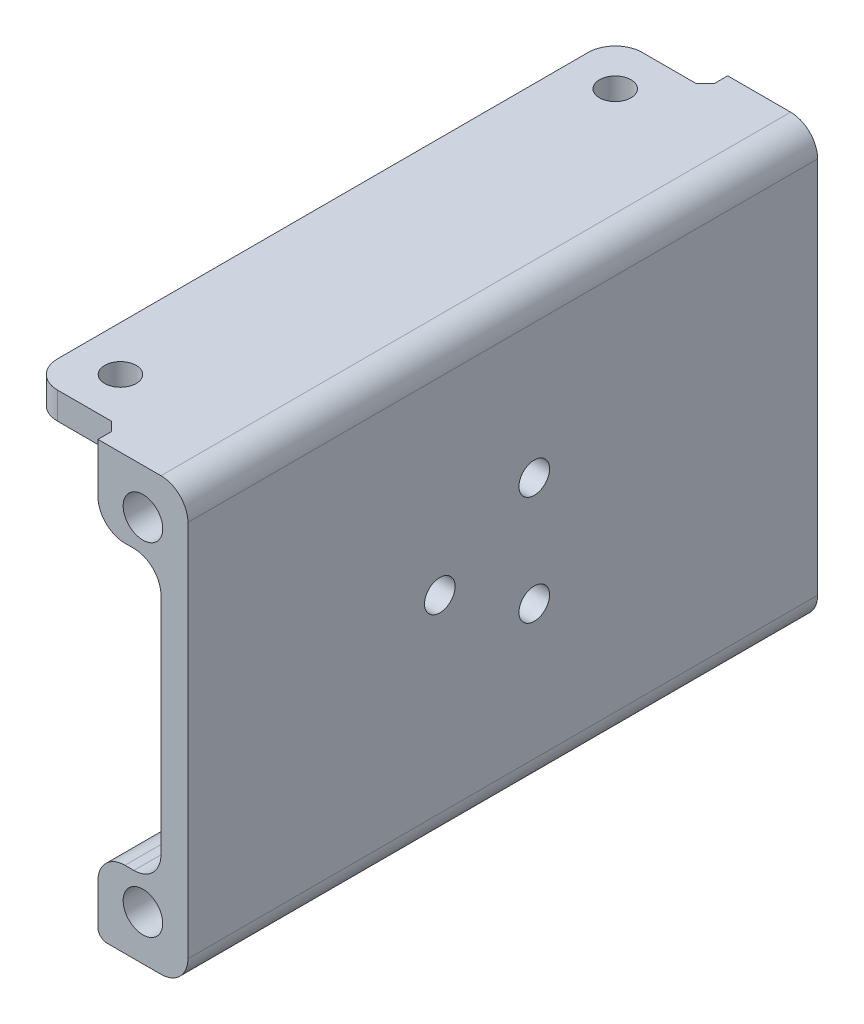
ISO-10303-21;
HEADER;
FILE_DESCRIPTION(('STEP AP214'),'2;1');
FILE_NAME('part.step','',(''),(''),'','','');
FILE_SCHEMA(('AUTOMOTIVE_DESIGN { 1 0 10303 214 1 1 1 1 }'));
ENDSEC;
DATA;
#1=APPLICATION_CONTEXT('core data for automotive mechanical design processes');
#2=APPLICATION_PROTOCOL_DEFINITION('international standard','automotive_design',2000,#1);
#3=PRODUCT_CONTEXT('',#1,'mechanical');
#4=PRODUCT('Part','Part','',(#3));
#5=PRODUCT_RELATED_PRODUCT_CATEGORY('part','',(#4));
#6=PRODUCT_DEFINITION_FORMATION('','',#4);
#7=PRODUCT_DEFINITION_CONTEXT('part definition',#1,'design');
#8=PRODUCT_DEFINITION('design','',#6,#7);
#9=PRODUCT_DEFINITION_SHAPE('','',#8);
#10=(LENGTH_UNIT() NAMED_UNIT(*) SI_UNIT(.MILLI.,.METRE.));
#11=(NAMED_UNIT(*) PLANE_ANGLE_UNIT() SI_UNIT($,.RADIAN.));
#12=(NAMED_UNIT(*) SI_UNIT($,.STERADIAN.) SOLID_ANGLE_UNIT());
#13=UNCERTAINTY_MEASURE_WITH_UNIT(LENGTH_MEASURE(1.E-05),#10,'distance_accuracy_value','');
#14=(GEOMETRIC_REPRESENTATION_CONTEXT(3) GLOBAL_UNCERTAINTY_ASSIGNED_CONTEXT((#13)) GLOBAL_UNIT_ASSIGNED_CONTEXT((#10,
#11,#12)) REPRESENTATION_CONTEXT('',''));
#15=CARTESIAN_POINT('',(0.,0.,0.));
#16=DIRECTION('',(0.,0.,1.));
#17=DIRECTION('',(1.,0.,0.));
#18=AXIS2_PLACEMENT_3D('',#15,#16,#17);
#19=CARTESIAN_POINT('',(49.,24.,70.));
#20=DIRECTION('',(1.,0.,0.));
#21=DIRECTION('',(0.,0.,-1.));
#22=AXIS2_PLACEMENT_3D('',#19,#20,#21);
#23=PLANE('',#22);
#24=DIRECTION('',(0.,0.,-1.));
#25=VECTOR('',#24,1.);
#26=CARTESIAN_POINT('',(49.,20.,2.50000000000001));
#27=LINE('',#26,#25);
#28=CARTESIAN_POINT('',(49.,20.,68.5));
#29=VERTEX_POINT('',#28);
#30=CARTESIAN_POINT('',(49.,20.,1.5));
#31=VERTEX_POINT('',#30);
#32=EDGE_CURVE('E395',#29,#31,#27,.T.);
#33=ORIENTED_EDGE('',*,*,#32,.T.);
#34=DIRECTION('',(0.,1.,0.));
#35=VECTOR('',#34,1.);
#36=CARTESIAN_POINT('',(49.,24.,1.5));
#37=LINE('',#36,#35);
#38=CARTESIAN_POINT('',(49.,24.,1.5));
#39=VERTEX_POINT('',#38);
#40=EDGE_CURVE('E397',#31,#39,#37,.T.);
#41=ORIENTED_EDGE('',*,*,#40,.T.);
#42=DIRECTION('',(0.,0.,-1.));
#43=VECTOR('',#42,1.);
#44=CARTESIAN_POINT('',(49.,24.,70.));
#45=LINE('',#44,#43);
#46=CARTESIAN_POINT('',(49.,24.,0.));
#47=VERTEX_POINT('',#46);
#48=EDGE_CURVE('E380',#39,#47,#45,.T.);
#49=ORIENTED_EDGE('',*,*,#48,.T.);
#50=DIRECTION('',(0.,-1.,0.));
#51=VECTOR('',#50,1.);
#52=CARTESIAN_POINT('',(49.,24.,0.));
#53=LINE('',#52,#51);
#54=CARTESIAN_POINT('',(49.,18.5,0.));
#55=VERTEX_POINT('',#54);
#56=EDGE_CURVE('E319',#47,#55,#53,.T.);
#57=ORIENTED_EDGE('',*,*,#56,.T.);
#58=DIRECTION('',(0.,0.,-1.));
#59=VECTOR('',#58,1.);
#60=CARTESIAN_POINT('',(49.,18.5,70.));
#61=LINE('',#60,#59);
#62=CARTESIAN_POINT('',(49.,18.5,70.));
#63=VERTEX_POINT('',#62);
#64=EDGE_CURVE('E377',#63,#55,#61,.T.);
#65=ORIENTED_EDGE('',*,*,#64,.F.);
#66=DIRECTION('',(0.,-1.,0.));
#67=VECTOR('',#66,1.);
#68=CARTESIAN_POINT('',(49.,24.,70.));
#69=LINE('',#68,#67);
#70=CARTESIAN_POINT('',(49.,24.,70.));
#71=VERTEX_POINT('',#70);
#72=EDGE_CURVE('E288',#71,#63,#69,.T.);
#73=ORIENTED_EDGE('',*,*,#72,.F.);
#74=CARTESIAN_POINT('',(49.,24.,68.5));
#75=VERTEX_POINT('',#74);
#76=EDGE_CURVE('E381',#71,#75,#45,.T.);
#77=ORIENTED_EDGE('',*,*,#76,.T.);
#78=DIRECTION('',(0.,-1.,0.));
#79=VECTOR('',#78,1.);
#80=CARTESIAN_POINT('',(49.,21.,68.5));
#81=LINE('',#80,#79);
#82=EDGE_CURVE('E393',#75,#29,#81,.T.);
#83=ORIENTED_EDGE('',*,*,#82,.T.);
#84=EDGE_LOOP('',(#33,#41,#49,#57,#65,#73,#77,#83));
#85=FACE_BOUND('',#84,.T.);
#86=ADVANCED_FACE('F41',(#85),#23,.F.);
#87=CARTESIAN_POINT('',(49.,24.,70.));
#88=DIRECTION('',(0.,-1.,0.));
#89=DIRECTION('',(0.,0.,-1.));
#90=AXIS2_PLACEMENT_3D('',#87,#88,#89);
#91=PLANE('',#90);
#92=DIRECTION('',(-1.,0.,0.));
#93=VECTOR('',#92,1.);
#94=CARTESIAN_POINT('',(49.,24.,0.));
#95=LINE('',#94,#93);
#96=CARTESIAN_POINT('',(56.,24.,0.));
#97=VERTEX_POINT('',#96);
#98=EDGE_CURVE('E276',#97,#47,#95,.T.);
#99=ORIENTED_EDGE('',*,*,#98,.T.);
#100=ORIENTED_EDGE('',*,*,#48,.F.);
#101=DIRECTION('',(0.707106781186554,0.,-0.707106781186541));
#102=VECTOR('',#101,1.);
#103=CARTESIAN_POINT('',(14.75,24.,35.7499999999994));
#104=LINE('',#103,#102);
#105=CARTESIAN_POINT('',(48.,24.,2.50000000000001));
#106=VERTEX_POINT('',#105);
#107=EDGE_CURVE('E51',#39,#106,#104,.F.);
#108=ORIENTED_EDGE('',*,*,#107,.T.);
#109=DIRECTION('',(1.,0.,0.));
#110=VECTOR('',#109,1.);
#111=CARTESIAN_POINT('',(49.,24.,2.50000000000001));
#112=LINE('',#111,#110);
#113=CARTESIAN_POINT('',(42.,24.,2.50000000000001));
#114=VERTEX_POINT('',#113);
#115=EDGE_CURVE('E203',#114,#106,#112,.T.);
#116=ORIENTED_EDGE('',*,*,#115,.F.);
#117=CARTESIAN_POINT('',(42.,24.,5.50000000000001));
#118=DIRECTION('',(0.,-1.,0.));
#119=DIRECTION('',(0.,0.,-1.));
#120=AXIS2_PLACEMENT_3D('',#117,#118,#119);
#121=CIRCLE('',#120,3.);
#122=CARTESIAN_POINT('',(39.,24.,5.50000000000003));
#123=VERTEX_POINT('',#122);
#124=EDGE_CURVE('E233',#123,#114,#121,.T.);
#125=ORIENTED_EDGE('',*,*,#124,.F.);
#126=DIRECTION('',(0.,0.,-1.));
#127=VECTOR('',#126,1.);
#128=CARTESIAN_POINT('',(39.,24.,5.50000000000003));
#129=LINE('',#128,#127);
#130=CARTESIAN_POINT('',(39.,24.,64.5));
#131=VERTEX_POINT('',#130);
#132=EDGE_CURVE('E231',#131,#123,#129,.T.);
#133=ORIENTED_EDGE('',*,*,#132,.F.);
#134=CARTESIAN_POINT('',(42.,24.,64.5));
#135=DIRECTION('',(0.,-1.,0.));
#136=DIRECTION('',(0.,0.,1.));
#137=AXIS2_PLACEMENT_3D('',#134,#135,#136);
#138=CIRCLE('',#137,3.);
#139=CARTESIAN_POINT('',(42.,24.,67.5));
#140=VERTEX_POINT('',#139);
#141=EDGE_CURVE('E228',#140,#131,#138,.T.);
#142=ORIENTED_EDGE('',*,*,#141,.F.);
#143=DIRECTION('',(-1.,0.,0.));
#144=VECTOR('',#143,1.);
#145=CARTESIAN_POINT('',(49.,24.,67.5));
#146=LINE('',#145,#144);
#147=CARTESIAN_POINT('',(48.,24.,67.5));
#148=VERTEX_POINT('',#147);
#149=EDGE_CURVE('E208',#148,#140,#146,.T.);
#150=ORIENTED_EDGE('',*,*,#149,.F.);
#151=DIRECTION('',(-0.707106781186555,0.,-0.70710678118654));
#152=VECTOR('',#151,1.);
#153=CARTESIAN_POINT('',(49.75,24.,69.25));
#154=LINE('',#153,#152);
#155=EDGE_CURVE('E12',#148,#75,#154,.F.);
#156=ORIENTED_EDGE('',*,*,#155,.T.);
#157=ORIENTED_EDGE('',*,*,#76,.F.);
#158=DIRECTION('',(-1.,0.,0.));
#159=VECTOR('',#158,1.);
#160=CARTESIAN_POINT('',(49.,24.,70.));
#161=LINE('',#160,#159);
#162=CARTESIAN_POINT('',(56.,24.,70.));
#163=VERTEX_POINT('',#162);
#164=EDGE_CURVE('E285',#163,#71,#161,.T.);
#165=ORIENTED_EDGE('',*,*,#164,.F.);
#166=DIRECTION('',(0.,0.,-1.));
#167=VECTOR('',#166,1.);
#168=CARTESIAN_POINT('',(56.,24.,70.));
#169=LINE('',#168,#167);
#170=EDGE_CURVE('E316',#163,#97,#169,.T.);
#171=ORIENTED_EDGE('',*,*,#170,.T.);
#172=EDGE_LOOP('',(#99,#100,#108,#116,#125,#133,#142,#150,#156,#157,#165,#171));
#173=FACE_BOUND('',#172,.T.);
#174=CARTESIAN_POINT('',(44.,24.,62.5));
#175=DIRECTION('',(0.,-1.,0.));
#176=DIRECTION('',(0.,0.,-1.));
#177=AXIS2_PLACEMENT_3D('',#174,#175,#176);
#178=CIRCLE('',#177,1.75);
#179=CARTESIAN_POINT('',(44.,24.,60.75));
#180=VERTEX_POINT('',#179);
#181=EDGE_CURVE('E421',#180,#180,#178,.T.);
#182=ORIENTED_EDGE('',*,*,#181,.T.);
#183=EDGE_LOOP('',(#182));
#184=FACE_BOUND('',#183,.T.);
#185=CARTESIAN_POINT('',(44.,24.,7.50000000000001));
#186=DIRECTION('',(0.,-1.,0.));
#187=DIRECTION('',(0.,0.,1.));
#188=AXIS2_PLACEMENT_3D('',#185,#186,#187);
#189=CIRCLE('',#188,1.75);
#190=CARTESIAN_POINT('',(44.,24.,9.25000000000001));
#191=VERTEX_POINT('',#190);
#192=EDGE_CURVE('E411',#191,#191,#189,.T.);
#193=ORIENTED_EDGE('',*,*,#192,.T.);
#194=EDGE_LOOP('',(#193));
#195=FACE_BOUND('',#194,.T.);
#196=ADVANCED_FACE('F428',(#173,#184,#195),#91,.F.);
#197=CARTESIAN_POINT('',(52.,18.5,70.));
#198=DIRECTION('',(0.,0.,-1.));
#199=DIRECTION('',(-1.,0.,0.));
#200=AXIS2_PLACEMENT_3D('',#197,#198,#199);
#201=CYLINDRICAL_SURFACE('',#200,3.);
#202=CARTESIAN_POINT('',(52.,18.5,0.));
#203=DIRECTION('',(0.,0.,1.));
#204=DIRECTION('',(-1.,0.,0.));
#205=AXIS2_PLACEMENT_3D('',#202,#203,#204);
#206=CIRCLE('',#205,3.);
#207=CARTESIAN_POINT('',(52.,15.5,0.));
#208=VERTEX_POINT('',#207);
#209=EDGE_CURVE('E321',#55,#208,#206,.T.);
#210=ORIENTED_EDGE('',*,*,#209,.T.);
#211=DIRECTION('',(0.,0.,-1.));
#212=VECTOR('',#211,1.);
#213=CARTESIAN_POINT('',(52.,15.5,70.));
#214=LINE('',#213,#212);
#215=CARTESIAN_POINT('',(52.,15.5,70.));
#216=VERTEX_POINT('',#215);
#217=EDGE_CURVE('E374',#216,#208,#214,.T.);
#218=ORIENTED_EDGE('',*,*,#217,.F.);
#219=CARTESIAN_POINT('',(52.,18.5,70.));
#220=DIRECTION('',(0.,0.,1.));
#221=DIRECTION('',(-1.,0.,0.));
#222=AXIS2_PLACEMENT_3D('',#219,#220,#221);
#223=CIRCLE('',#222,3.);
#224=EDGE_CURVE('E291',#63,#216,#223,.T.);
#225=ORIENTED_EDGE('',*,*,#224,.F.);
#226=ORIENTED_EDGE('',*,*,#64,.T.);
#227=EDGE_LOOP('',(#210,#218,#225,#226));
#228=FACE_BOUND('',#227,.T.);
#229=ADVANCED_FACE('F452',(#228),#201,.T.);
#230=CARTESIAN_POINT('',(52.,15.5,70.));
#231=DIRECTION('',(0.,1.,0.));
#232=DIRECTION('',(0.,0.,1.));
#233=AXIS2_PLACEMENT_3D('',#230,#231,#232);
#234=PLANE('',#233);
#235=DIRECTION('',(1.,0.,0.));
#236=VECTOR('',#235,1.);
#237=CARTESIAN_POINT('',(52.,15.5,0.));
#238=LINE('',#237,#236);
#239=CARTESIAN_POINT('',(53.,15.5,0.));
#240=VERTEX_POINT('',#239);
#241=EDGE_CURVE('E323',#208,#240,#238,.T.);
#242=ORIENTED_EDGE('',*,*,#241,.T.);
#243=DIRECTION('',(0.,0.,-1.));
#244=VECTOR('',#243,1.);
#245=CARTESIAN_POINT('',(53.,15.5,70.));
#246=LINE('',#245,#244);
#247=CARTESIAN_POINT('',(53.,15.5,70.));
#248=VERTEX_POINT('',#247);
#249=EDGE_CURVE('E371',#248,#240,#246,.T.);
#250=ORIENTED_EDGE('',*,*,#249,.F.);
#251=DIRECTION('',(1.,0.,0.));
#252=VECTOR('',#251,1.);
#253=CARTESIAN_POINT('',(52.,15.5,70.));
#254=LINE('',#253,#252);
#255=EDGE_CURVE('E293',#216,#248,#254,.T.);
#256=ORIENTED_EDGE('',*,*,#255,.F.);
#257=ORIENTED_EDGE('',*,*,#217,.T.);
#258=EDGE_LOOP('',(#242,#250,#256,#257));
#259=FACE_BOUND('',#258,.T.);
#260=ADVANCED_FACE('F508',(#259),#234,.F.);
#261=CARTESIAN_POINT('',(53.,12.5,70.));
#262=DIRECTION('',(0.,0.,-1.));
#263=DIRECTION('',(-1.,0.,0.));
#264=AXIS2_PLACEMENT_3D('',#261,#262,#263);
#265=CYLINDRICAL_SURFACE('',#264,3.);
#266=CARTESIAN_POINT('',(53.,12.5,0.));
#267=DIRECTION('',(0.,0.,-1.));
#268=DIRECTION('',(1.,0.,0.));
#269=AXIS2_PLACEMENT_3D('',#266,#267,#268);
#270=CIRCLE('',#269,3.);
#271=CARTESIAN_POINT('',(56.,12.5,0.));
#272=VERTEX_POINT('',#271);
#273=EDGE_CURVE('E325',#240,#272,#270,.T.);
#274=ORIENTED_EDGE('',*,*,#273,.T.);
#275=DIRECTION('',(0.,0.,-1.));
#276=VECTOR('',#275,1.);
#277=CARTESIAN_POINT('',(56.,12.5,70.));
#278=LINE('',#277,#276);
#279=CARTESIAN_POINT('',(56.,12.5,70.));
#280=VERTEX_POINT('',#279);
#281=EDGE_CURVE('E368',#280,#272,#278,.T.);
#282=ORIENTED_EDGE('',*,*,#281,.F.);
#283=CARTESIAN_POINT('',(53.,12.5,70.));
#284=DIRECTION('',(0.,0.,-1.));
#285=DIRECTION('',(1.,0.,0.));
#286=AXIS2_PLACEMENT_3D('',#283,#284,#285);
#287=CIRCLE('',#286,3.);
#288=EDGE_CURVE('E295',#248,#280,#287,.T.);
#289=ORIENTED_EDGE('',*,*,#288,.F.);
#290=ORIENTED_EDGE('',*,*,#249,.T.);
#291=EDGE_LOOP('',(#274,#282,#289,#290));
#292=FACE_BOUND('',#291,.T.);
#293=ADVANCED_FACE('F511',(#292),#265,.F.);
#294=CARTESIAN_POINT('',(56.,12.5,70.));
#295=DIRECTION('',(1.,0.,0.));
#296=DIRECTION('',(0.,1.,0.));
#297=AXIS2_PLACEMENT_3D('',#294,#295,#296);
#298=PLANE('',#297);
#299=CARTESIAN_POINT('',(56.,0.,42.));
#300=DIRECTION('',(1.,0.,0.));
#301=DIRECTION('',(0.,1.,0.));
#302=AXIS2_PLACEMENT_3D('',#299,#300,#301);
#303=CIRCLE('',#302,1.7);
#304=CARTESIAN_POINT('',(56.,1.70000000000002,42.));
#305=VERTEX_POINT('',#304);
#306=EDGE_CURVE('E257',#305,#305,#303,.T.);
#307=ORIENTED_EDGE('',*,*,#306,.T.);
#308=EDGE_LOOP('',(#307));
#309=FACE_BOUND('',#308,.T.);
#310=CARTESIAN_POINT('',(56.,6.06217782649107,31.5));
#311=DIRECTION('',(1.,0.,0.));
#312=DIRECTION('',(0.,1.,0.));
#313=AXIS2_PLACEMENT_3D('',#310,#311,#312);
#314=CIRCLE('',#313,1.7);
#315=CARTESIAN_POINT('',(56.,7.76217782649108,31.5));
#316=VERTEX_POINT('',#315);
#317=EDGE_CURVE('E254',#316,#316,#314,.T.);
#318=ORIENTED_EDGE('',*,*,#317,.T.);
#319=EDGE_LOOP('',(#318));
#320=FACE_BOUND('',#319,.T.);
#321=CARTESIAN_POINT('',(56.,-6.06217782649104,31.5));
#322=DIRECTION('',(1.,0.,0.));
#323=DIRECTION('',(0.,1.,0.));
#324=AXIS2_PLACEMENT_3D('',#321,#322,#323);
#325=CIRCLE('',#324,1.70000000000001);
#326=CARTESIAN_POINT('',(56.,-4.36217782649103,31.5));
#327=VERTEX_POINT('',#326);
#328=EDGE_CURVE('E246',#327,#327,#325,.T.);
#329=ORIENTED_EDGE('',*,*,#328,.T.);
#330=EDGE_LOOP('',(#329));
#331=FACE_BOUND('',#330,.T.);
#332=DIRECTION('',(0.,-1.,0.));
#333=VECTOR('',#332,1.);
#334=CARTESIAN_POINT('',(56.,12.5,0.));
#335=LINE('',#334,#333);
#336=CARTESIAN_POINT('',(56.,-12.5,0.));
#337=VERTEX_POINT('',#336);
#338=EDGE_CURVE('E327',#272,#337,#335,.T.);
#339=ORIENTED_EDGE('',*,*,#338,.T.);
#340=DIRECTION('',(0.,0.,-1.));
#341=VECTOR('',#340,1.);
#342=CARTESIAN_POINT('',(56.,-12.5,70.));
#343=LINE('',#342,#341);
#344=CARTESIAN_POINT('',(56.,-12.5,70.));
#345=VERTEX_POINT('',#344);
#346=EDGE_CURVE('E365',#345,#337,#343,.T.);
#347=ORIENTED_EDGE('',*,*,#346,.F.);
#348=DIRECTION('',(0.,-1.,0.));
#349=VECTOR('',#348,1.);
#350=CARTESIAN_POINT('',(56.,12.5,70.));
#351=LINE('',#350,#349);
#352=EDGE_CURVE('E297',#280,#345,#351,.T.);
#353=ORIENTED_EDGE('',*,*,#352,.F.);
#354=ORIENTED_EDGE('',*,*,#281,.T.);
#355=EDGE_LOOP('',(#339,#347,#353,#354));
#356=FACE_BOUND('',#355,.T.);
#357=ADVANCED_FACE('F516',(#309,#320,#331,#356),#298,.F.);
#358=CARTESIAN_POINT('',(53.,-12.5,70.));
#359=DIRECTION('',(0.,0.,-1.));
#360=DIRECTION('',(-1.,0.,0.));
#361=AXIS2_PLACEMENT_3D('',#358,#359,#360);
#362=CYLINDRICAL_SURFACE('',#361,3.00000000000001);
#363=CARTESIAN_POINT('',(53.,-12.5,0.));
#364=DIRECTION('',(0.,0.,-1.));
#365=DIRECTION('',(-1.,0.,0.));
#366=AXIS2_PLACEMENT_3D('',#363,#364,#365);
#367=CIRCLE('',#366,3.00000000000001);
#368=CARTESIAN_POINT('',(53.,-15.5,0.));
#369=VERTEX_POINT('',#368);
#370=EDGE_CURVE('E329',#337,#369,#367,.T.);
#371=ORIENTED_EDGE('',*,*,#370,.T.);
#372=DIRECTION('',(0.,0.,-1.));
#373=VECTOR('',#372,1.);
#374=CARTESIAN_POINT('',(53.,-15.5,70.));
#375=LINE('',#374,#373);
#376=CARTESIAN_POINT('',(53.,-15.5,70.));
#377=VERTEX_POINT('',#376);
#378=EDGE_CURVE('E362',#377,#369,#375,.T.);
#379=ORIENTED_EDGE('',*,*,#378,.F.);
#380=CARTESIAN_POINT('',(53.,-12.5,70.));
#381=DIRECTION('',(0.,0.,-1.));
#382=DIRECTION('',(-1.,0.,0.));
#383=AXIS2_PLACEMENT_3D('',#380,#381,#382);
#384=CIRCLE('',#383,3.00000000000001);
#385=EDGE_CURVE('E299',#345,#377,#384,.T.);
#386=ORIENTED_EDGE('',*,*,#385,.F.);
#387=ORIENTED_EDGE('',*,*,#346,.T.);
#388=EDGE_LOOP('',(#371,#379,#386,#387));
#389=FACE_BOUND('',#388,.T.);
#390=ADVANCED_FACE('F522',(#389),#362,.F.);
#391=CARTESIAN_POINT('',(53.,-15.5,70.));
#392=DIRECTION('',(0.,-1.,0.));
#393=DIRECTION('',(1.,0.,0.));
#394=AXIS2_PLACEMENT_3D('',#391,#392,#393);
#395=PLANE('',#394);
#396=DIRECTION('',(-1.,0.,0.));
#397=VECTOR('',#396,1.);
#398=CARTESIAN_POINT('',(53.,-15.5,0.));
#399=LINE('',#398,#397);
#400=CARTESIAN_POINT('',(52.,-15.5,0.));
#401=VERTEX_POINT('',#400);
#402=EDGE_CURVE('E331',#369,#401,#399,.T.);
#403=ORIENTED_EDGE('',*,*,#402,.T.);
#404=DIRECTION('',(0.,0.,-1.));
#405=VECTOR('',#404,1.);
#406=CARTESIAN_POINT('',(52.,-15.5,70.));
#407=LINE('',#406,#405);
#408=CARTESIAN_POINT('',(52.,-15.5,70.));
#409=VERTEX_POINT('',#408);
#410=EDGE_CURVE('E359',#409,#401,#407,.T.);
#411=ORIENTED_EDGE('',*,*,#410,.F.);
#412=DIRECTION('',(-1.,0.,0.));
#413=VECTOR('',#412,1.);
#414=CARTESIAN_POINT('',(53.,-15.5,70.));
#415=LINE('',#414,#413);
#416=EDGE_CURVE('E301',#377,#409,#415,.T.);
#417=ORIENTED_EDGE('',*,*,#416,.F.);
#418=ORIENTED_EDGE('',*,*,#378,.T.);
#419=EDGE_LOOP('',(#403,#411,#417,#418));
#420=FACE_BOUND('',#419,.T.);
#421=ADVANCED_FACE('F526',(#420),#395,.F.);
#422=CARTESIAN_POINT('',(52.,-18.5,70.));
#423=DIRECTION('',(0.,0.,-1.));
#424=DIRECTION('',(-1.,0.,0.));
#425=AXIS2_PLACEMENT_3D('',#422,#423,#424);
#426=CYLINDRICAL_SURFACE('',#425,3.);
#427=CARTESIAN_POINT('',(52.,-18.5,0.));
#428=DIRECTION('',(0.,0.,1.));
#429=DIRECTION('',(1.,0.,0.));
#430=AXIS2_PLACEMENT_3D('',#427,#428,#429);
#431=CIRCLE('',#430,3.);
#432=CARTESIAN_POINT('',(49.,-18.5,0.));
#433=VERTEX_POINT('',#432);
#434=EDGE_CURVE('E333',#401,#433,#431,.T.);
#435=ORIENTED_EDGE('',*,*,#434,.T.);
#436=DIRECTION('',(0.,0.,-1.));
#437=VECTOR('',#436,1.);
#438=CARTESIAN_POINT('',(49.,-18.5,70.));
#439=LINE('',#438,#437);
#440=CARTESIAN_POINT('',(49.,-18.5,70.));
#441=VERTEX_POINT('',#440);
#442=EDGE_CURVE('E356',#441,#433,#439,.T.);
#443=ORIENTED_EDGE('',*,*,#442,.F.);
#444=CARTESIAN_POINT('',(52.,-18.5,70.));
#445=DIRECTION('',(0.,0.,1.));
#446=DIRECTION('',(1.,0.,0.));
#447=AXIS2_PLACEMENT_3D('',#444,#445,#446);
#448=CIRCLE('',#447,3.);
#449=EDGE_CURVE('E303',#409,#441,#448,.T.);
#450=ORIENTED_EDGE('',*,*,#449,.F.);
#451=ORIENTED_EDGE('',*,*,#410,.T.);
#452=EDGE_LOOP('',(#435,#443,#450,#451));
#453=FACE_BOUND('',#452,.T.);
#454=ADVANCED_FACE('F531',(#453),#426,.T.);
#455=CARTESIAN_POINT('',(49.,-18.5,70.));
#456=DIRECTION('',(1.,0.,0.));
#457=DIRECTION('',(0.,0.,-1.));
#458=AXIS2_PLACEMENT_3D('',#455,#456,#457);
#459=PLANE('',#458);
#460=DIRECTION('',(0.,-1.,0.));
#461=VECTOR('',#460,1.);
#462=CARTESIAN_POINT('',(49.,-18.5,0.));
#463=LINE('',#462,#461);
#464=CARTESIAN_POINT('',(49.,-23.,0.));
#465=VERTEX_POINT('',#464);
#466=EDGE_CURVE('E335',#433,#465,#463,.T.);
#467=ORIENTED_EDGE('',*,*,#466,.T.);
#468=DIRECTION('',(0.,0.,-1.));
#469=VECTOR('',#468,1.);
#470=CARTESIAN_POINT('',(49.,-23.,70.));
#471=LINE('',#470,#469);
#472=CARTESIAN_POINT('',(49.,-23.,70.));
#473=VERTEX_POINT('',#472);
#474=EDGE_CURVE('E389',#465,#473,#471,.F.);
#475=ORIENTED_EDGE('',*,*,#474,.T.);
#476=DIRECTION('',(0.,-1.,0.));
#477=VECTOR('',#476,1.);
#478=CARTESIAN_POINT('',(49.,-18.5,70.));
#479=LINE('',#478,#477);
#480=EDGE_CURVE('E305',#441,#473,#479,.T.);
#481=ORIENTED_EDGE('',*,*,#480,.F.);
#482=ORIENTED_EDGE('',*,*,#442,.T.);
#483=EDGE_LOOP('',(#467,#475,#481,#482));
#484=FACE_BOUND('',#483,.T.);
#485=ADVANCED_FACE('F568',(#484),#459,.F.);
#486=CARTESIAN_POINT('',(49.,-24.,70.));
#487=DIRECTION('',(0.,1.,0.));
#488=DIRECTION('',(-1.,0.,0.));
#489=AXIS2_PLACEMENT_3D('',#486,#487,#488);
#490=PLANE('',#489);
#491=DIRECTION('',(1.,0.,0.));
#492=VECTOR('',#491,1.);
#493=CARTESIAN_POINT('',(49.,-24.,70.));
#494=LINE('',#493,#492);
#495=CARTESIAN_POINT('',(50.,-24.,70.));
#496=VERTEX_POINT('',#495);
#497=CARTESIAN_POINT('',(56.,-24.,70.));
#498=VERTEX_POINT('',#497);
#499=EDGE_CURVE('E308',#496,#498,#494,.T.);
#500=ORIENTED_EDGE('',*,*,#499,.F.);
#501=DIRECTION('',(0.,0.,-1.));
#502=VECTOR('',#501,1.);
#503=CARTESIAN_POINT('',(50.,-24.,70.));
#504=LINE('',#503,#502);
#505=CARTESIAN_POINT('',(50.,-24.,0.));
#506=VERTEX_POINT('',#505);
#507=EDGE_CURVE('E384',#496,#506,#504,.T.);
#508=ORIENTED_EDGE('',*,*,#507,.T.);
#509=DIRECTION('',(1.,0.,0.));
#510=VECTOR('',#509,1.);
#511=CARTESIAN_POINT('',(49.,-24.,0.));
#512=LINE('',#511,#510);
#513=CARTESIAN_POINT('',(56.,-24.,0.));
#514=VERTEX_POINT('',#513);
#515=EDGE_CURVE('E338',#506,#514,#512,.T.);
#516=ORIENTED_EDGE('',*,*,#515,.T.);
#517=DIRECTION('',(0.,0.,-1.));
#518=VECTOR('',#517,1.);
#519=CARTESIAN_POINT('',(56.,-24.,70.));
#520=LINE('',#519,#518);
#521=EDGE_CURVE('E353',#498,#514,#520,.T.);
#522=ORIENTED_EDGE('',*,*,#521,.F.);
#523=EDGE_LOOP('',(#500,#508,#516,#522));
#524=FACE_BOUND('',#523,.T.);
#525=ADVANCED_FACE('F539',(#524),#490,.F.);
#526=CARTESIAN_POINT('',(56.,-21.,70.));
#527=DIRECTION('',(0.,0.,-1.));
#528=DIRECTION('',(-1.,0.,0.));
#529=AXIS2_PLACEMENT_3D('',#526,#527,#528);
#530=CYLINDRICAL_SURFACE('',#529,3.);
#531=CARTESIAN_POINT('',(56.,-21.,0.));
#532=DIRECTION('',(0.,0.,1.));
#533=DIRECTION('',(1.,0.,0.));
#534=AXIS2_PLACEMENT_3D('',#531,#532,#533);
#535=CIRCLE('',#534,3.);
#536=CARTESIAN_POINT('',(59.,-21.,0.));
#537=VERTEX_POINT('',#536);
#538=EDGE_CURVE('E340',#514,#537,#535,.T.);
#539=ORIENTED_EDGE('',*,*,#538,.T.);
#540=DIRECTION('',(0.,0.,-1.));
#541=VECTOR('',#540,1.);
#542=CARTESIAN_POINT('',(59.,-21.,70.));
#543=LINE('',#542,#541);
#544=CARTESIAN_POINT('',(59.,-21.,70.));
#545=VERTEX_POINT('',#544);
#546=EDGE_CURVE('E350',#545,#537,#543,.T.);
#547=ORIENTED_EDGE('',*,*,#546,.F.);
#548=CARTESIAN_POINT('',(56.,-21.,70.));
#549=DIRECTION('',(0.,0.,1.));
#550=DIRECTION('',(1.,0.,0.));
#551=AXIS2_PLACEMENT_3D('',#548,#549,#550);
#552=CIRCLE('',#551,3.);
#553=EDGE_CURVE('E310',#498,#545,#552,.T.);
#554=ORIENTED_EDGE('',*,*,#553,.F.);
#555=ORIENTED_EDGE('',*,*,#521,.T.);
#556=EDGE_LOOP('',(#539,#547,#554,#555));
#557=FACE_BOUND('',#556,.T.);
#558=ADVANCED_FACE('F545',(#557),#530,.T.);
#559=CARTESIAN_POINT('',(59.,21.,70.));
#560=DIRECTION('',(-1.,0.,0.));
#561=DIRECTION('',(0.,-1.,0.));
#562=AXIS2_PLACEMENT_3D('',#559,#560,#561);
#563=PLANE('',#562);
#564=CARTESIAN_POINT('',(59.,0.,42.));
#565=DIRECTION('',(1.,0.,0.));
#566=DIRECTION('',(0.,1.,0.));
#567=AXIS2_PLACEMENT_3D('',#564,#565,#566);
#568=CIRCLE('',#567,1.7);
#569=CARTESIAN_POINT('',(59.,1.70000000000002,42.));
#570=VERTEX_POINT('',#569);
#571=EDGE_CURVE('E243',#570,#570,#568,.T.);
#572=ORIENTED_EDGE('',*,*,#571,.F.);
#573=EDGE_LOOP('',(#572));
#574=FACE_BOUND('',#573,.T.);
#575=CARTESIAN_POINT('',(59.,6.06217782649107,31.5));
#576=DIRECTION('',(1.,0.,0.));
#577=DIRECTION('',(0.,1.,0.));
#578=AXIS2_PLACEMENT_3D('',#575,#576,#577);
#579=CIRCLE('',#578,1.7);
#580=CARTESIAN_POINT('',(59.,7.76217782649108,31.5));
#581=VERTEX_POINT('',#580);
#582=EDGE_CURVE('E247',#581,#581,#579,.T.);
#583=ORIENTED_EDGE('',*,*,#582,.F.);
#584=EDGE_LOOP('',(#583));
#585=FACE_BOUND('',#584,.T.);
#586=CARTESIAN_POINT('',(59.,-6.06217782649104,31.5));
#587=DIRECTION('',(1.,0.,0.));
#588=DIRECTION('',(0.,1.,0.));
#589=AXIS2_PLACEMENT_3D('',#586,#587,#588);
#590=CIRCLE('',#589,1.70000000000001);
#591=CARTESIAN_POINT('',(59.,-4.36217782649103,31.5));
#592=VERTEX_POINT('',#591);
#593=EDGE_CURVE('E211',#592,#592,#590,.T.);
#594=ORIENTED_EDGE('',*,*,#593,.F.);
#595=EDGE_LOOP('',(#594));
#596=FACE_BOUND('',#595,.T.);
#597=DIRECTION('',(0.,1.,0.));
#598=VECTOR('',#597,1.);
#599=CARTESIAN_POINT('',(59.,21.,0.));
#600=LINE('',#599,#598);
#601=CARTESIAN_POINT('',(59.,21.,0.));
#602=VERTEX_POINT('',#601);
#603=EDGE_CURVE('E342',#537,#602,#600,.T.);
#604=ORIENTED_EDGE('',*,*,#603,.T.);
#605=DIRECTION('',(0.,0.,-1.));
#606=VECTOR('',#605,1.);
#607=CARTESIAN_POINT('',(59.,21.,70.));
#608=LINE('',#607,#606);
#609=CARTESIAN_POINT('',(59.,21.,70.));
#610=VERTEX_POINT('',#609);
#611=EDGE_CURVE('E347',#610,#602,#608,.T.);
#612=ORIENTED_EDGE('',*,*,#611,.F.);
#613=DIRECTION('',(0.,1.,0.));
#614=VECTOR('',#613,1.);
#615=CARTESIAN_POINT('',(59.,21.,70.));
#616=LINE('',#615,#614);
#617=EDGE_CURVE('E312',#545,#610,#616,.T.);
#618=ORIENTED_EDGE('',*,*,#617,.F.);
#619=ORIENTED_EDGE('',*,*,#546,.T.);
#620=EDGE_LOOP('',(#604,#612,#618,#619));
#621=FACE_BOUND('',#620,.T.);
#622=ADVANCED_FACE('F549',(#574,#585,#596,#621),#563,.F.);
#623=CARTESIAN_POINT('',(56.,21.,70.));
#624=DIRECTION('',(0.,0.,-1.));
#625=DIRECTION('',(-1.,0.,0.));
#626=AXIS2_PLACEMENT_3D('',#623,#624,#625);
#627=CYLINDRICAL_SURFACE('',#626,3.);
#628=CARTESIAN_POINT('',(56.,21.,0.));
#629=DIRECTION('',(0.,0.,1.));
#630=DIRECTION('',(1.,0.,0.));
#631=AXIS2_PLACEMENT_3D('',#628,#629,#630);
#632=CIRCLE('',#631,3.);
#633=EDGE_CURVE('E289',#602,#97,#632,.T.);
#634=ORIENTED_EDGE('',*,*,#633,.T.);
#635=ORIENTED_EDGE('',*,*,#170,.F.);
#636=CARTESIAN_POINT('',(56.,21.,70.));
#637=DIRECTION('',(0.,0.,1.));
#638=DIRECTION('',(1.,0.,0.));
#639=AXIS2_PLACEMENT_3D('',#636,#637,#638);
#640=CIRCLE('',#639,3.);
#641=EDGE_CURVE('E314',#610,#163,#640,.T.);
#642=ORIENTED_EDGE('',*,*,#641,.F.);
#643=ORIENTED_EDGE('',*,*,#611,.T.);
#644=EDGE_LOOP('',(#634,#635,#642,#643));
#645=FACE_BOUND('',#644,.T.);
#646=ADVANCED_FACE('F551',(#645),#627,.T.);
#647=CARTESIAN_POINT('',(56.,21.,70.));
#648=DIRECTION('',(0.,0.,1.));
#649=DIRECTION('',(1.,0.,0.));
#650=AXIS2_PLACEMENT_3D('',#647,#648,#649);
#651=PLANE('',#650);
#652=CARTESIAN_POINT('',(54.,-19.,70.));
#653=DIRECTION('',(0.,0.,-1.));
#654=DIRECTION('',(-1.,0.,0.));
#655=AXIS2_PLACEMENT_3D('',#652,#653,#654);
#656=CIRCLE('',#655,2.2);
#657=CARTESIAN_POINT('',(51.8,-19.,70.));
#658=VERTEX_POINT('',#657);
#659=EDGE_CURVE('E265',#658,#658,#656,.T.);
#660=ORIENTED_EDGE('',*,*,#659,.T.);
#661=EDGE_LOOP('',(#660));
#662=FACE_BOUND('',#661,.T.);
#663=CARTESIAN_POINT('',(54.,19.,70.));
#664=DIRECTION('',(0.,0.,-1.));
#665=DIRECTION('',(-1.,0.,0.));
#666=AXIS2_PLACEMENT_3D('',#663,#664,#665);
#667=CIRCLE('',#666,2.2);
#668=CARTESIAN_POINT('',(51.8,19.,70.));
#669=VERTEX_POINT('',#668);
#670=EDGE_CURVE('E260',#669,#669,#667,.T.);
#671=ORIENTED_EDGE('',*,*,#670,.T.);
#672=EDGE_LOOP('',(#671));
#673=FACE_BOUND('',#672,.T.);
#674=ORIENTED_EDGE('',*,*,#480,.T.);
#675=CARTESIAN_POINT('',(50.,-23.,70.));
#676=DIRECTION('',(0.,0.,1.));
#677=DIRECTION('',(1.,0.,0.));
#678=AXIS2_PLACEMENT_3D('',#675,#676,#677);
#679=CIRCLE('',#678,1.);
#680=EDGE_CURVE('E391',#473,#496,#679,.T.);
#681=ORIENTED_EDGE('',*,*,#680,.T.);
#682=ORIENTED_EDGE('',*,*,#499,.T.);
#683=ORIENTED_EDGE('',*,*,#553,.T.);
#684=ORIENTED_EDGE('',*,*,#617,.T.);
#685=ORIENTED_EDGE('',*,*,#641,.T.);
#686=ORIENTED_EDGE('',*,*,#164,.T.);
#687=ORIENTED_EDGE('',*,*,#72,.T.);
#688=ORIENTED_EDGE('',*,*,#224,.T.);
#689=ORIENTED_EDGE('',*,*,#255,.T.);
#690=ORIENTED_EDGE('',*,*,#288,.T.);
#691=ORIENTED_EDGE('',*,*,#352,.T.);
#692=ORIENTED_EDGE('',*,*,#385,.T.);
#693=ORIENTED_EDGE('',*,*,#416,.T.);
#694=ORIENTED_EDGE('',*,*,#449,.T.);
#695=EDGE_LOOP('',(#674,#681,#682,#683,#684,#685,#686,#687,#688,#689,#690,#691,#692,#693,#694));
#696=FACE_BOUND('',#695,.T.);
#697=ADVANCED_FACE('F487',(#662,#673,#696),#651,.T.);
#698=CARTESIAN_POINT('',(56.,21.,0.));
#699=DIRECTION('',(0.,0.,1.));
#700=DIRECTION('',(1.,0.,0.));
#701=AXIS2_PLACEMENT_3D('',#698,#699,#700);
#702=PLANE('',#701);
#703=CARTESIAN_POINT('',(54.,-19.,0.));
#704=DIRECTION('',(0.,0.,-1.));
#705=DIRECTION('',(-1.,0.,0.));
#706=AXIS2_PLACEMENT_3D('',#703,#704,#705);
#707=CIRCLE('',#706,2.2);
#708=CARTESIAN_POINT('',(51.8,-19.,0.));
#709=VERTEX_POINT('',#708);
#710=EDGE_CURVE('E277',#709,#709,#707,.T.);
#711=ORIENTED_EDGE('',*,*,#710,.F.);
#712=EDGE_LOOP('',(#711));
#713=FACE_BOUND('',#712,.T.);
#714=CARTESIAN_POINT('',(54.,19.,0.));
#715=DIRECTION('',(0.,0.,-1.));
#716=DIRECTION('',(-1.,0.,0.));
#717=AXIS2_PLACEMENT_3D('',#714,#715,#716);
#718=CIRCLE('',#717,2.2);
#719=CARTESIAN_POINT('',(51.8,19.,0.));
#720=VERTEX_POINT('',#719);
#721=EDGE_CURVE('E280',#720,#720,#718,.T.);
#722=ORIENTED_EDGE('',*,*,#721,.F.);
#723=EDGE_LOOP('',(#722));
#724=FACE_BOUND('',#723,.T.);
#725=ORIENTED_EDGE('',*,*,#515,.F.);
#726=CARTESIAN_POINT('',(50.,-23.,0.));
#727=DIRECTION('',(0.,0.,1.));
#728=DIRECTION('',(1.,0.,0.));
#729=AXIS2_PLACEMENT_3D('',#726,#727,#728);
#730=CIRCLE('',#729,1.);
#731=EDGE_CURVE('E387',#506,#465,#730,.F.);
#732=ORIENTED_EDGE('',*,*,#731,.T.);
#733=ORIENTED_EDGE('',*,*,#466,.F.);
#734=ORIENTED_EDGE('',*,*,#434,.F.);
#735=ORIENTED_EDGE('',*,*,#402,.F.);
#736=ORIENTED_EDGE('',*,*,#370,.F.);
#737=ORIENTED_EDGE('',*,*,#338,.F.);
#738=ORIENTED_EDGE('',*,*,#273,.F.);
#739=ORIENTED_EDGE('',*,*,#241,.F.);
#740=ORIENTED_EDGE('',*,*,#209,.F.);
#741=ORIENTED_EDGE('',*,*,#56,.F.);
#742=ORIENTED_EDGE('',*,*,#98,.F.);
#743=ORIENTED_EDGE('',*,*,#633,.F.);
#744=ORIENTED_EDGE('',*,*,#603,.F.);
#745=ORIENTED_EDGE('',*,*,#538,.F.);
#746=EDGE_LOOP('',(#725,#732,#733,#734,#735,#736,#737,#738,#739,#740,#741,#742,#743,#744,#745));
#747=FACE_BOUND('',#746,.T.);
#748=ADVANCED_FACE('F497',(#713,#724,#747),#702,.F.);
#749=CARTESIAN_POINT('',(54.,19.,5.3));
#750=DIRECTION('',(0.,0.,-1.));
#751=DIRECTION('',(-1.,0.,0.));
#752=AXIS2_PLACEMENT_3D('',#749,#750,#751);
#753=CYLINDRICAL_SURFACE('',#752,2.2);
#754=CARTESIAN_POINT('',(54.,19.,5.3));
#755=DIRECTION('',(0.,0.,-1.));
#756=DIRECTION('',(-1.,0.,0.));
#757=AXIS2_PLACEMENT_3D('',#754,#755,#756);
#758=CIRCLE('',#757,2.2);
#759=CARTESIAN_POINT('',(51.8,19.,5.3));
#760=VERTEX_POINT('',#759);
#761=EDGE_CURVE('E264',#760,#760,#758,.T.);
#762=ORIENTED_EDGE('',*,*,#761,.F.);
#763=EDGE_LOOP('',(#762));
#764=FACE_BOUND('',#763,.T.);
#765=ORIENTED_EDGE('',*,*,#721,.T.);
#766=EDGE_LOOP('',(#765));
#767=FACE_BOUND('',#766,.T.);
#768=ADVANCED_FACE('F787',(#764,#767),#753,.F.);
#769=CARTESIAN_POINT('',(54.,19.,5.3));
#770=DIRECTION('',(0.,0.,-1.));
#771=DIRECTION('',(-1.,0.,0.));
#772=AXIS2_PLACEMENT_3D('',#769,#770,#771);
#773=PLANE('',#772);
#774=ORIENTED_EDGE('',*,*,#761,.T.);
#775=EDGE_LOOP('',(#774));
#776=FACE_BOUND('',#775,.T.);
#777=ADVANCED_FACE('F777',(#776),#773,.T.);
#778=CARTESIAN_POINT('',(54.,-19.,5.3));
#779=DIRECTION('',(0.,0.,-1.));
#780=DIRECTION('',(-1.,0.,0.));
#781=AXIS2_PLACEMENT_3D('',#778,#779,#780);
#782=CYLINDRICAL_SURFACE('',#781,2.2);
#783=CARTESIAN_POINT('',(54.,-19.,5.3));
#784=DIRECTION('',(0.,0.,-1.));
#785=DIRECTION('',(-1.,0.,0.));
#786=AXIS2_PLACEMENT_3D('',#783,#784,#785);
#787=CIRCLE('',#786,2.2);
#788=CARTESIAN_POINT('',(51.8,-19.,5.3));
#789=VERTEX_POINT('',#788);
#790=EDGE_CURVE('E273',#789,#789,#787,.T.);
#791=ORIENTED_EDGE('',*,*,#790,.F.);
#792=EDGE_LOOP('',(#791));
#793=FACE_BOUND('',#792,.T.);
#794=ORIENTED_EDGE('',*,*,#710,.T.);
#795=EDGE_LOOP('',(#794));
#796=FACE_BOUND('',#795,.T.);
#797=ADVANCED_FACE('F767',(#793,#796),#782,.F.);
#798=CARTESIAN_POINT('',(54.,-19.,5.3));
#799=DIRECTION('',(0.,0.,-1.));
#800=DIRECTION('',(-1.,0.,0.));
#801=AXIS2_PLACEMENT_3D('',#798,#799,#800);
#802=PLANE('',#801);
#803=ORIENTED_EDGE('',*,*,#790,.T.);
#804=EDGE_LOOP('',(#803));
#805=FACE_BOUND('',#804,.T.);
#806=ADVANCED_FACE('F757',(#805),#802,.T.);
#807=CARTESIAN_POINT('',(54.,19.,64.7));
#808=DIRECTION('',(0.,0.,1.));
#809=DIRECTION('',(1.,0.,0.));
#810=AXIS2_PLACEMENT_3D('',#807,#808,#809);
#811=CYLINDRICAL_SURFACE('',#810,2.2);
#812=CARTESIAN_POINT('',(54.,19.,64.7));
#813=DIRECTION('',(0.,0.,-1.));
#814=DIRECTION('',(-1.,0.,0.));
#815=AXIS2_PLACEMENT_3D('',#812,#813,#814);
#816=CIRCLE('',#815,2.2);
#817=CARTESIAN_POINT('',(51.8,19.,64.7));
#818=VERTEX_POINT('',#817);
#819=EDGE_CURVE('E268',#818,#818,#816,.T.);
#820=ORIENTED_EDGE('',*,*,#819,.T.);
#821=EDGE_LOOP('',(#820));
#822=FACE_BOUND('',#821,.T.);
#823=ORIENTED_EDGE('',*,*,#670,.F.);
#824=EDGE_LOOP('',(#823));
#825=FACE_BOUND('',#824,.T.);
#826=ADVANCED_FACE('F747',(#822,#825),#811,.F.);
#827=CARTESIAN_POINT('',(54.,19.,64.7));
#828=DIRECTION('',(0.,0.,1.));
#829=DIRECTION('',(-1.,0.,0.));
#830=AXIS2_PLACEMENT_3D('',#827,#828,#829);
#831=PLANE('',#830);
#832=ORIENTED_EDGE('',*,*,#819,.F.);
#833=EDGE_LOOP('',(#832));
#834=FACE_BOUND('',#833,.T.);
#835=ADVANCED_FACE('F737',(#834),#831,.T.);
#836=CARTESIAN_POINT('',(54.,-19.,64.7));
#837=DIRECTION('',(0.,0.,1.));
#838=DIRECTION('',(1.,0.,0.));
#839=AXIS2_PLACEMENT_3D('',#836,#837,#838);
#840=CYLINDRICAL_SURFACE('',#839,2.2);
#841=CARTESIAN_POINT('',(54.,-19.,64.7));
#842=DIRECTION('',(0.,0.,-1.));
#843=DIRECTION('',(-1.,0.,0.));
#844=AXIS2_PLACEMENT_3D('',#841,#842,#843);
#845=CIRCLE('',#844,2.2);
#846=CARTESIAN_POINT('',(51.8,-19.,64.7));
#847=VERTEX_POINT('',#846);
#848=EDGE_CURVE('E261',#847,#847,#845,.T.);
#849=ORIENTED_EDGE('',*,*,#848,.T.);
#850=EDGE_LOOP('',(#849));
#851=FACE_BOUND('',#850,.T.);
#852=ORIENTED_EDGE('',*,*,#659,.F.);
#853=EDGE_LOOP('',(#852));
#854=FACE_BOUND('',#853,.T.);
#855=ADVANCED_FACE('F727',(#851,#854),#840,.F.);
#856=CARTESIAN_POINT('',(54.,-19.,64.7));
#857=DIRECTION('',(0.,0.,1.));
#858=DIRECTION('',(-1.,0.,0.));
#859=AXIS2_PLACEMENT_3D('',#856,#857,#858);
#860=PLANE('',#859);
#861=ORIENTED_EDGE('',*,*,#848,.F.);
#862=EDGE_LOOP('',(#861));
#863=FACE_BOUND('',#862,.T.);
#864=ADVANCED_FACE('F462',(#863),#860,.T.);
#865=CARTESIAN_POINT('',(50.,-23.,70.));
#866=DIRECTION('',(0.,0.,-1.));
#867=DIRECTION('',(-1.,0.,0.));
#868=AXIS2_PLACEMENT_3D('',#865,#866,#867);
#869=CYLINDRICAL_SURFACE('',#868,1.);
#870=ORIENTED_EDGE('',*,*,#680,.F.);
#871=ORIENTED_EDGE('',*,*,#474,.F.);
#872=ORIENTED_EDGE('',*,*,#731,.F.);
#873=ORIENTED_EDGE('',*,*,#507,.F.);
#874=EDGE_LOOP('',(#870,#871,#872,#873));
#875=FACE_BOUND('',#874,.T.);
#876=ADVANCED_FACE('F458',(#875),#869,.T.);
#877=CARTESIAN_POINT('',(49.,-6.06217782649104,31.5));
#878=DIRECTION('',(1.,0.,0.));
#879=DIRECTION('',(0.,1.,0.));
#880=AXIS2_PLACEMENT_3D('',#877,#878,#879);
#881=CYLINDRICAL_SURFACE('',#880,1.70000000000001);
#882=ORIENTED_EDGE('',*,*,#593,.T.);
#883=EDGE_LOOP('',(#882));
#884=FACE_BOUND('',#883,.T.);
#885=ORIENTED_EDGE('',*,*,#328,.F.);
#886=EDGE_LOOP('',(#885));
#887=FACE_BOUND('',#886,.T.);
#888=ADVANCED_FACE('F461',(#884,#887),#881,.F.);
#889=CARTESIAN_POINT('',(49.,6.06217782649107,31.5));
#890=DIRECTION('',(1.,0.,0.));
#891=DIRECTION('',(0.,1.,0.));
#892=AXIS2_PLACEMENT_3D('',#889,#890,#891);
#893=CYLINDRICAL_SURFACE('',#892,1.7);
#894=ORIENTED_EDGE('',*,*,#582,.T.);
#895=EDGE_LOOP('',(#894));
#896=FACE_BOUND('',#895,.T.);
#897=ORIENTED_EDGE('',*,*,#317,.F.);
#898=EDGE_LOOP('',(#897));
#899=FACE_BOUND('',#898,.T.);
#900=ADVANCED_FACE('F693',(#896,#899),#893,.F.);
#901=CARTESIAN_POINT('',(49.,0.,42.));
#902=DIRECTION('',(1.,0.,0.));
#903=DIRECTION('',(0.,1.,0.));
#904=AXIS2_PLACEMENT_3D('',#901,#902,#903);
#905=CYLINDRICAL_SURFACE('',#904,1.7);
#906=ORIENTED_EDGE('',*,*,#571,.T.);
#907=EDGE_LOOP('',(#906));
#908=FACE_BOUND('',#907,.T.);
#909=ORIENTED_EDGE('',*,*,#306,.F.);
#910=EDGE_LOOP('',(#909));
#911=FACE_BOUND('',#910,.T.);
#912=ADVANCED_FACE('F605',(#908,#911),#905,.F.);
#913=CARTESIAN_POINT('',(42.,21.,64.5));
#914=DIRECTION('',(0.,1.,0.));
#915=DIRECTION('',(0.,0.,1.));
#916=AXIS2_PLACEMENT_3D('',#913,#914,#915);
#917=PLANE('',#916);
#918=DIRECTION('',(1.,0.,0.));
#919=VECTOR('',#918,1.);
#920=CARTESIAN_POINT('',(49.,21.,2.50000000000001));
#921=LINE('',#920,#919);
#922=CARTESIAN_POINT('',(42.,21.,2.50000000000001));
#923=VERTEX_POINT('',#922);
#924=CARTESIAN_POINT('',(48.,21.,2.50000000000001));
#925=VERTEX_POINT('',#924);
#926=EDGE_CURVE('E224',#923,#925,#921,.T.);
#927=ORIENTED_EDGE('',*,*,#926,.T.);
#928=DIRECTION('',(0.,0.,1.));
#929=VECTOR('',#928,1.);
#930=CARTESIAN_POINT('',(48.,21.,67.5));
#931=LINE('',#930,#929);
#932=CARTESIAN_POINT('',(48.,21.,67.5));
#933=VERTEX_POINT('',#932);
#934=EDGE_CURVE('E67',#925,#933,#931,.T.);
#935=ORIENTED_EDGE('',*,*,#934,.T.);
#936=DIRECTION('',(-1.,0.,0.));
#937=VECTOR('',#936,1.);
#938=CARTESIAN_POINT('',(49.,21.,67.5));
#939=LINE('',#938,#937);
#940=CARTESIAN_POINT('',(42.,21.,67.5));
#941=VERTEX_POINT('',#940);
#942=EDGE_CURVE('E196',#933,#941,#939,.T.);
#943=ORIENTED_EDGE('',*,*,#942,.T.);
#944=CARTESIAN_POINT('',(42.,21.,64.5));
#945=DIRECTION('',(0.,-1.,0.));
#946=DIRECTION('',(0.,0.,1.));
#947=AXIS2_PLACEMENT_3D('',#944,#945,#946);
#948=CIRCLE('',#947,3.);
#949=CARTESIAN_POINT('',(39.,21.,64.5));
#950=VERTEX_POINT('',#949);
#951=EDGE_CURVE('E201',#941,#950,#948,.T.);
#952=ORIENTED_EDGE('',*,*,#951,.T.);
#953=DIRECTION('',(0.,0.,-1.));
#954=VECTOR('',#953,1.);
#955=CARTESIAN_POINT('',(39.,21.,5.50000000000003));
#956=LINE('',#955,#954);
#957=CARTESIAN_POINT('',(39.,21.,5.50000000000003));
#958=VERTEX_POINT('',#957);
#959=EDGE_CURVE('E217',#950,#958,#956,.T.);
#960=ORIENTED_EDGE('',*,*,#959,.T.);
#961=CARTESIAN_POINT('',(42.,21.,5.50000000000001));
#962=DIRECTION('',(0.,-1.,0.));
#963=DIRECTION('',(0.,0.,-1.));
#964=AXIS2_PLACEMENT_3D('',#961,#962,#963);
#965=CIRCLE('',#964,3.);
#966=EDGE_CURVE('E219',#958,#923,#965,.T.);
#967=ORIENTED_EDGE('',*,*,#966,.T.);
#968=EDGE_LOOP('',(#927,#935,#943,#952,#960,#967));
#969=FACE_BOUND('',#968,.T.);
#970=CARTESIAN_POINT('',(44.,21.,62.5));
#971=DIRECTION('',(0.,-1.,0.));
#972=DIRECTION('',(0.,0.,-1.));
#973=AXIS2_PLACEMENT_3D('',#970,#971,#972);
#974=CIRCLE('',#973,1.75);
#975=CARTESIAN_POINT('',(44.,21.,60.75));
#976=VERTEX_POINT('',#975);
#977=EDGE_CURVE('E229',#976,#976,#974,.T.);
#978=ORIENTED_EDGE('',*,*,#977,.F.);
#979=EDGE_LOOP('',(#978));
#980=FACE_BOUND('',#979,.T.);
#981=CARTESIAN_POINT('',(44.,21.,7.50000000000001));
#982=DIRECTION('',(0.,-1.,0.));
#983=DIRECTION('',(0.,0.,1.));
#984=AXIS2_PLACEMENT_3D('',#981,#982,#983);
#985=CIRCLE('',#984,1.75);
#986=CARTESIAN_POINT('',(44.,21.,9.25000000000001));
#987=VERTEX_POINT('',#986);
#988=EDGE_CURVE('E416',#987,#987,#985,.T.);
#989=ORIENTED_EDGE('',*,*,#988,.F.);
#990=EDGE_LOOP('',(#989));
#991=FACE_BOUND('',#990,.T.);
#992=ADVANCED_FACE('F198',(#969,#980,#991),#917,.F.);
#993=CARTESIAN_POINT('',(49.,21.,67.5));
#994=DIRECTION('',(0.,0.,-1.));
#995=DIRECTION('',(-1.,0.,0.));
#996=AXIS2_PLACEMENT_3D('',#993,#994,#995);
#997=PLANE('',#996);
#998=ORIENTED_EDGE('',*,*,#942,.F.);
#999=DIRECTION('',(0.,1.,0.));
#1000=VECTOR('',#999,1.);
#1001=CARTESIAN_POINT('',(48.,24.,67.5));
#1002=LINE('',#1001,#1000);
#1003=EDGE_CURVE('E59',#933,#148,#1002,.T.);
#1004=ORIENTED_EDGE('',*,*,#1003,.T.);
#1005=ORIENTED_EDGE('',*,*,#149,.T.);
#1006=DIRECTION('',(0.,1.,0.));
#1007=VECTOR('',#1006,1.);
#1008=CARTESIAN_POINT('',(42.,21.,67.5));
#1009=LINE('',#1008,#1007);
#1010=EDGE_CURVE('E206',#941,#140,#1009,.T.);
#1011=ORIENTED_EDGE('',*,*,#1010,.F.);
#1012=EDGE_LOOP('',(#998,#1004,#1005,#1011));
#1013=FACE_BOUND('',#1012,.T.);
#1014=ADVANCED_FACE('F207',(#1013),#997,.F.);
#1015=CARTESIAN_POINT('',(42.,21.,64.5));
#1016=DIRECTION('',(0.,1.,0.));
#1017=DIRECTION('',(0.,0.,1.));
#1018=AXIS2_PLACEMENT_3D('',#1015,#1016,#1017);
#1019=CYLINDRICAL_SURFACE('',#1018,3.);
#1020=ORIENTED_EDGE('',*,*,#141,.T.);
#1021=DIRECTION('',(0.,1.,0.));
#1022=VECTOR('',#1021,1.);
#1023=CARTESIAN_POINT('',(39.,21.,64.5));
#1024=LINE('',#1023,#1022);
#1025=EDGE_CURVE('E212',#950,#131,#1024,.T.);
#1026=ORIENTED_EDGE('',*,*,#1025,.F.);
#1027=ORIENTED_EDGE('',*,*,#951,.F.);
#1028=ORIENTED_EDGE('',*,*,#1010,.T.);
#1029=EDGE_LOOP('',(#1020,#1026,#1027,#1028));
#1030=FACE_BOUND('',#1029,.T.);
#1031=ADVANCED_FACE('F214',(#1030),#1019,.T.);
#1032=CARTESIAN_POINT('',(39.,21.,5.50000000000003));
#1033=DIRECTION('',(1.,0.,0.));
#1034=DIRECTION('',(0.,0.,-1.));
#1035=AXIS2_PLACEMENT_3D('',#1032,#1033,#1034);
#1036=PLANE('',#1035);
#1037=ORIENTED_EDGE('',*,*,#132,.T.);
#1038=DIRECTION('',(0.,1.,0.));
#1039=VECTOR('',#1038,1.);
#1040=CARTESIAN_POINT('',(39.,21.,5.50000000000003));
#1041=LINE('',#1040,#1039);
#1042=EDGE_CURVE('E239',#958,#123,#1041,.T.);
#1043=ORIENTED_EDGE('',*,*,#1042,.F.);
#1044=ORIENTED_EDGE('',*,*,#959,.F.);
#1045=ORIENTED_EDGE('',*,*,#1025,.T.);
#1046=EDGE_LOOP('',(#1037,#1043,#1044,#1045));
#1047=FACE_BOUND('',#1046,.T.);
#1048=ADVANCED_FACE('F664',(#1047),#1036,.F.);
#1049=CARTESIAN_POINT('',(42.,21.,5.50000000000001));
#1050=DIRECTION('',(0.,1.,0.));
#1051=DIRECTION('',(0.,0.,1.));
#1052=AXIS2_PLACEMENT_3D('',#1049,#1050,#1051);
#1053=CYLINDRICAL_SURFACE('',#1052,3.);
#1054=ORIENTED_EDGE('',*,*,#124,.T.);
#1055=DIRECTION('',(0.,1.,0.));
#1056=VECTOR('',#1055,1.);
#1057=CARTESIAN_POINT('',(42.,21.,2.50000000000001));
#1058=LINE('',#1057,#1056);
#1059=EDGE_CURVE('E226',#923,#114,#1058,.T.);
#1060=ORIENTED_EDGE('',*,*,#1059,.F.);
#1061=ORIENTED_EDGE('',*,*,#966,.F.);
#1062=ORIENTED_EDGE('',*,*,#1042,.T.);
#1063=EDGE_LOOP('',(#1054,#1060,#1061,#1062));
#1064=FACE_BOUND('',#1063,.T.);
#1065=ADVANCED_FACE('F442',(#1064),#1053,.T.);
#1066=CARTESIAN_POINT('',(49.,21.,2.50000000000001));
#1067=DIRECTION('',(0.,0.,1.));
#1068=DIRECTION('',(1.,0.,0.));
#1069=AXIS2_PLACEMENT_3D('',#1066,#1067,#1068);
#1070=PLANE('',#1069);
#1071=ORIENTED_EDGE('',*,*,#115,.T.);
#1072=DIRECTION('',(0.,-1.,0.));
#1073=VECTOR('',#1072,1.);
#1074=CARTESIAN_POINT('',(48.,21.,2.50000000000001));
#1075=LINE('',#1074,#1073);
#1076=EDGE_CURVE('E400',#106,#925,#1075,.T.);
#1077=ORIENTED_EDGE('',*,*,#1076,.T.);
#1078=ORIENTED_EDGE('',*,*,#926,.F.);
#1079=ORIENTED_EDGE('',*,*,#1059,.T.);
#1080=EDGE_LOOP('',(#1071,#1077,#1078,#1079));
#1081=FACE_BOUND('',#1080,.T.);
#1082=ADVANCED_FACE('F433',(#1081),#1070,.F.);
#1083=CARTESIAN_POINT('',(44.,21.,62.5));
#1084=DIRECTION('',(0.,1.,0.));
#1085=DIRECTION('',(0.,0.,1.));
#1086=AXIS2_PLACEMENT_3D('',#1083,#1084,#1085);
#1087=CYLINDRICAL_SURFACE('',#1086,1.75);
#1088=ORIENTED_EDGE('',*,*,#977,.T.);
#1089=EDGE_LOOP('',(#1088));
#1090=FACE_BOUND('',#1089,.T.);
#1091=ORIENTED_EDGE('',*,*,#181,.F.);
#1092=EDGE_LOOP('',(#1091));
#1093=FACE_BOUND('',#1092,.T.);
#1094=ADVANCED_FACE('F430',(#1090,#1093),#1087,.F.);
#1095=CARTESIAN_POINT('',(44.,21.,7.50000000000001));
#1096=DIRECTION('',(0.,1.,0.));
#1097=DIRECTION('',(0.,0.,1.));
#1098=AXIS2_PLACEMENT_3D('',#1095,#1096,#1097);
#1099=CYLINDRICAL_SURFACE('',#1098,1.75);
#1100=ORIENTED_EDGE('',*,*,#988,.T.);
#1101=EDGE_LOOP('',(#1100));
#1102=FACE_BOUND('',#1101,.T.);
#1103=ORIENTED_EDGE('',*,*,#192,.F.);
#1104=EDGE_LOOP('',(#1103));
#1105=FACE_BOUND('',#1104,.T.);
#1106=ADVANCED_FACE('F432',(#1102,#1105),#1099,.F.);
#1107=CARTESIAN_POINT('',(48.,21.,67.5));
#1108=DIRECTION('',(-0.70710678118654,0.,0.707106781186555));
#1109=DIRECTION('',(0.,-1.,0.));
#1110=AXIS2_PLACEMENT_3D('',#1107,#1108,#1109);
#1111=PLANE('',#1110);
#1112=ORIENTED_EDGE('',*,*,#155,.F.);
#1113=ORIENTED_EDGE('',*,*,#1003,.F.);
#1114=DIRECTION('',(0.577350269189634,-0.577350269189622,0.577350269189622));
#1115=VECTOR('',#1114,1.);
#1116=CARTESIAN_POINT('',(48.,21.,67.5));
#1117=LINE('',#1116,#1115);
#1118=EDGE_CURVE('E46',#29,#933,#1117,.F.);
#1119=ORIENTED_EDGE('',*,*,#1118,.F.);
#1120=ORIENTED_EDGE('',*,*,#82,.F.);
#1121=EDGE_LOOP('',(#1112,#1113,#1119,#1120));
#1122=FACE_BOUND('',#1121,.T.);
#1123=ADVANCED_FACE('F44',(#1122),#1111,.T.);
#1124=CARTESIAN_POINT('',(48.,21.,64.5));
#1125=DIRECTION('',(-0.70710678118654,-0.707106781186555,0.));
#1126=DIRECTION('',(0.,0.,-1.));
#1127=AXIS2_PLACEMENT_3D('',#1124,#1125,#1126);
#1128=PLANE('',#1127);
#1129=ORIENTED_EDGE('',*,*,#1118,.T.);
#1130=ORIENTED_EDGE('',*,*,#934,.F.);
#1131=DIRECTION('',(0.577350269189633,-0.577350269189621,-0.577350269189623));
#1132=VECTOR('',#1131,1.);
#1133=CARTESIAN_POINT('',(27.3333333333332,41.6666666666664,23.1666666666665));
#1134=LINE('',#1133,#1132);
#1135=EDGE_CURVE('E404',#31,#925,#1134,.F.);
#1136=ORIENTED_EDGE('',*,*,#1135,.F.);
#1137=ORIENTED_EDGE('',*,*,#32,.F.);
#1138=EDGE_LOOP('',(#1129,#1130,#1136,#1137));
#1139=FACE_BOUND('',#1138,.T.);
#1140=ADVANCED_FACE('F470',(#1139),#1128,.T.);
#1141=CARTESIAN_POINT('',(49.,24.,1.5));
#1142=DIRECTION('',(-0.707106781186541,0.,-0.707106781186554));
#1143=DIRECTION('',(0.,-1.,0.));
#1144=AXIS2_PLACEMENT_3D('',#1141,#1142,#1143);
#1145=PLANE('',#1144);
#1146=ORIENTED_EDGE('',*,*,#1135,.T.);
#1147=ORIENTED_EDGE('',*,*,#1076,.F.);
#1148=ORIENTED_EDGE('',*,*,#107,.F.);
#1149=ORIENTED_EDGE('',*,*,#40,.F.);
#1150=EDGE_LOOP('',(#1146,#1147,#1148,#1149));
#1151=FACE_BOUND('',#1150,.T.);
#1152=ADVANCED_FACE('F465',(#1151),#1145,.T.);
#1153=CLOSED_SHELL('',(#86,#196,#229,#260,#293,#357,#390,#421,#454,#485,#525,#558,#622,#646,
#697,#748,#768,#777,#797,#806,#826,#835,#855,#864,#876,#888,#900,#912,#992,#1014,#1031,#1048,
#1065,#1082,#1094,#1106,#1123,#1140,#1152));
#1154=MANIFOLD_SOLID_BREP('B2',#1153);
#1155=ADVANCED_BREP_SHAPE_REPRESENTATION('',(#18,#1154),#14);
#1156=SHAPE_DEFINITION_REPRESENTATION(#9,#1155);
ENDSEC;
END-ISO-10303-21;
